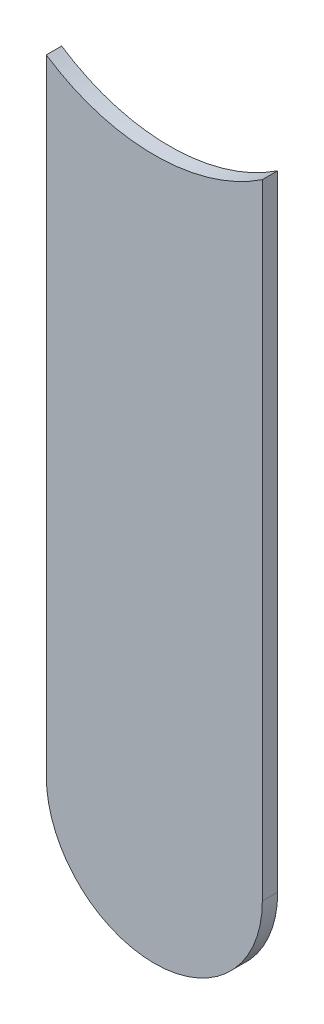
ISO-10303-21;
HEADER;
FILE_DESCRIPTION(('STEP AP214'),'2;1');
FILE_NAME('part.step','',(''),(''),'','','');
FILE_SCHEMA(('AUTOMOTIVE_DESIGN { 1 0 10303 214 1 1 1 1 }'));
ENDSEC;
DATA;
#1=APPLICATION_CONTEXT('core data for automotive mechanical design processes');
#2=APPLICATION_PROTOCOL_DEFINITION('international standard','automotive_design',2000,#1);
#3=PRODUCT_CONTEXT('',#1,'mechanical');
#4=PRODUCT('Part','Part','',(#3));
#5=PRODUCT_RELATED_PRODUCT_CATEGORY('part','',(#4));
#6=PRODUCT_DEFINITION_FORMATION('','',#4);
#7=PRODUCT_DEFINITION_CONTEXT('part definition',#1,'design');
#8=PRODUCT_DEFINITION('design','',#6,#7);
#9=PRODUCT_DEFINITION_SHAPE('','',#8);
#10=(LENGTH_UNIT() NAMED_UNIT(*) SI_UNIT(.MILLI.,.METRE.));
#11=(NAMED_UNIT(*) PLANE_ANGLE_UNIT() SI_UNIT($,.RADIAN.));
#12=(NAMED_UNIT(*) SI_UNIT($,.STERADIAN.) SOLID_ANGLE_UNIT());
#13=UNCERTAINTY_MEASURE_WITH_UNIT(LENGTH_MEASURE(1.E-05),#10,'distance_accuracy_value','');
#14=(GEOMETRIC_REPRESENTATION_CONTEXT(3) GLOBAL_UNCERTAINTY_ASSIGNED_CONTEXT((#13)) GLOBAL_UNIT_ASSIGNED_CONTEXT((#10,
#11,#12)) REPRESENTATION_CONTEXT('',''));
#15=CARTESIAN_POINT('',(0.,0.,0.));
#16=DIRECTION('',(0.,0.,1.));
#17=DIRECTION('',(1.,0.,0.));
#18=AXIS2_PLACEMENT_3D('',#15,#16,#17);
#19=CARTESIAN_POINT('',(112.1100247,114.6800348,0.));
#20=DIRECTION('',(-1.,0.,0.));
#21=DIRECTION('',(0.,1.,0.));
#22=AXIS2_PLACEMENT_3D('',#19,#20,#21);
#23=PLANE('',#22);
#24=DIRECTION('',(0.,1.,0.));
#25=VECTOR('',#24,1.);
#26=CARTESIAN_POINT('',(112.1100247,114.6800348,0.03556));
#27=LINE('',#26,#25);
#28=CARTESIAN_POINT('',(112.1100247,114.6800348,0.03556));
#29=VERTEX_POINT('',#28);
#30=CARTESIAN_POINT('',(112.1100247,116.125830609654,0.03556));
#31=VERTEX_POINT('',#30);
#32=EDGE_CURVE('E11',#29,#31,#27,.T.);
#33=ORIENTED_EDGE('',*,*,#32,.F.);
#34=DIRECTION('',(0.,0.,1.));
#35=VECTOR('',#34,1.);
#36=CARTESIAN_POINT('',(112.1100247,114.6800348,0.));
#37=LINE('',#36,#35);
#38=CARTESIAN_POINT('',(112.1100247,114.6800348,0.));
#39=VERTEX_POINT('',#38);
#40=EDGE_CURVE('E24',#39,#29,#37,.T.);
#41=ORIENTED_EDGE('',*,*,#40,.F.);
#42=DIRECTION('',(0.,1.,0.));
#43=VECTOR('',#42,1.);
#44=CARTESIAN_POINT('',(112.1100247,114.6800348,0.));
#45=LINE('',#44,#43);
#46=CARTESIAN_POINT('',(112.1100247,116.125830609654,0.));
#47=VERTEX_POINT('',#46);
#48=EDGE_CURVE('E75',#39,#47,#45,.T.);
#49=ORIENTED_EDGE('',*,*,#48,.T.);
#50=DIRECTION('',(0.,0.,1.));
#51=VECTOR('',#50,1.);
#52=CARTESIAN_POINT('',(112.1100247,116.125830609654,0.));
#53=LINE('',#52,#51);
#54=EDGE_CURVE('E37',#47,#31,#53,.T.);
#55=ORIENTED_EDGE('',*,*,#54,.T.);
#56=EDGE_LOOP('',(#33,#41,#49,#55));
#57=FACE_BOUND('',#56,.T.);
#58=ADVANCED_FACE('F17',(#57),#23,.F.);
#59=CARTESIAN_POINT('',(111.8600252,116.4999956,0.));
#60=DIRECTION('',(0.,0.,-1.));
#61=DIRECTION('',(1.,0.,0.));
#62=AXIS2_PLACEMENT_3D('',#59,#60,#61);
#63=CYLINDRICAL_SURFACE('',#62,0.4499991);
#64=DIRECTION('',(0.,0.,1.));
#65=VECTOR('',#64,1.);
#66=CARTESIAN_POINT('',(111.6100257,116.125830609654,0.));
#67=LINE('',#66,#65);
#68=CARTESIAN_POINT('',(111.6100257,116.125830609654,0.));
#69=VERTEX_POINT('',#68);
#70=CARTESIAN_POINT('',(111.6100257,116.125830609654,0.03556));
#71=VERTEX_POINT('',#70);
#72=EDGE_CURVE('E67',#69,#71,#67,.T.);
#73=ORIENTED_EDGE('',*,*,#72,.T.);
#74=CARTESIAN_POINT('',(111.8600252,116.4999956,0.03556));
#75=DIRECTION('',(0.,0.,1.));
#76=DIRECTION('',(1.,0.,0.));
#77=AXIS2_PLACEMENT_3D('',#74,#75,#76);
#78=CIRCLE('',#77,0.4499991);
#79=EDGE_CURVE('E82',#71,#31,#78,.T.);
#80=ORIENTED_EDGE('',*,*,#79,.T.);
#81=ORIENTED_EDGE('',*,*,#54,.F.);
#82=CARTESIAN_POINT('',(111.8600252,116.4999956,0.));
#83=DIRECTION('',(0.,0.,1.));
#84=DIRECTION('',(1.,0.,0.));
#85=AXIS2_PLACEMENT_3D('',#82,#83,#84);
#86=CIRCLE('',#85,0.4499991);
#87=EDGE_CURVE('E80',#69,#47,#86,.T.);
#88=ORIENTED_EDGE('',*,*,#87,.F.);
#89=EDGE_LOOP('',(#73,#80,#81,#88));
#90=FACE_BOUND('',#89,.T.);
#91=ADVANCED_FACE('F88',(#90),#63,.F.);
#92=CARTESIAN_POINT('',(111.6100257,116.125830609654,0.));
#93=DIRECTION('',(1.,0.,0.));
#94=DIRECTION('',(0.,-1.,0.));
#95=AXIS2_PLACEMENT_3D('',#92,#93,#94);
#96=PLANE('',#95);
#97=DIRECTION('',(0.,-1.,0.));
#98=VECTOR('',#97,1.);
#99=CARTESIAN_POINT('',(111.6100257,116.4999956,0.03556));
#100=LINE('',#99,#98);
#101=CARTESIAN_POINT('',(111.6100257,114.6800348,0.03556));
#102=VERTEX_POINT('',#101);
#103=EDGE_CURVE('E71',#71,#102,#100,.T.);
#104=ORIENTED_EDGE('',*,*,#103,.F.);
#105=ORIENTED_EDGE('',*,*,#72,.F.);
#106=DIRECTION('',(0.,-1.,0.));
#107=VECTOR('',#106,1.);
#108=CARTESIAN_POINT('',(111.6100257,116.4999956,0.));
#109=LINE('',#108,#107);
#110=CARTESIAN_POINT('',(111.6100257,114.6800348,0.));
#111=VERTEX_POINT('',#110);
#112=EDGE_CURVE('E63',#69,#111,#109,.T.);
#113=ORIENTED_EDGE('',*,*,#112,.T.);
#114=DIRECTION('',(0.,0.,1.));
#115=VECTOR('',#114,1.);
#116=CARTESIAN_POINT('',(111.6100257,114.6800348,0.));
#117=LINE('',#116,#115);
#118=EDGE_CURVE('E53',#111,#102,#117,.T.);
#119=ORIENTED_EDGE('',*,*,#118,.T.);
#120=EDGE_LOOP('',(#104,#105,#113,#119));
#121=FACE_BOUND('',#120,.T.);
#122=ADVANCED_FACE('F66',(#121),#96,.F.);
#123=CARTESIAN_POINT('',(111.8600252,114.6800348,0.));
#124=DIRECTION('',(0.,0.,-1.));
#125=DIRECTION('',(-1.,0.,0.));
#126=AXIS2_PLACEMENT_3D('',#123,#124,#125);
#127=CYLINDRICAL_SURFACE('',#126,0.249999500000001);
#128=CARTESIAN_POINT('',(111.8600252,114.6800348,0.03556));
#129=DIRECTION('',(0.,0.,1.));
#130=DIRECTION('',(-1.,0.,0.));
#131=AXIS2_PLACEMENT_3D('',#128,#129,#130);
#132=CIRCLE('',#131,0.249999500000001);
#133=EDGE_CURVE('E59',#102,#29,#132,.T.);
#134=ORIENTED_EDGE('',*,*,#133,.F.);
#135=ORIENTED_EDGE('',*,*,#118,.F.);
#136=CARTESIAN_POINT('',(111.8600252,114.6800348,0.));
#137=DIRECTION('',(0.,0.,1.));
#138=DIRECTION('',(-1.,0.,0.));
#139=AXIS2_PLACEMENT_3D('',#136,#137,#138);
#140=CIRCLE('',#139,0.249999500000001);
#141=EDGE_CURVE('E57',#111,#39,#140,.T.);
#142=ORIENTED_EDGE('',*,*,#141,.T.);
#143=ORIENTED_EDGE('',*,*,#40,.T.);
#144=EDGE_LOOP('',(#134,#135,#142,#143));
#145=FACE_BOUND('',#144,.T.);
#146=ADVANCED_FACE('F55',(#145),#127,.T.);
#147=CARTESIAN_POINT('',(112.1100247,114.6800348,0.));
#148=DIRECTION('',(0.,0.,-1.));
#149=DIRECTION('',(-1.,0.,0.));
#150=AXIS2_PLACEMENT_3D('',#147,#148,#149);
#151=PLANE('',#150);
#152=ORIENTED_EDGE('',*,*,#48,.F.);
#153=ORIENTED_EDGE('',*,*,#141,.F.);
#154=ORIENTED_EDGE('',*,*,#112,.F.);
#155=ORIENTED_EDGE('',*,*,#87,.T.);
#156=EDGE_LOOP('',(#152,#153,#154,#155));
#157=FACE_BOUND('',#156,.T.);
#158=ADVANCED_FACE('F74',(#157),#151,.T.);
#159=CARTESIAN_POINT('',(112.1100247,114.6800348,0.03556));
#160=DIRECTION('',(0.,0.,-1.));
#161=DIRECTION('',(-1.,0.,0.));
#162=AXIS2_PLACEMENT_3D('',#159,#160,#161);
#163=PLANE('',#162);
#164=ORIENTED_EDGE('',*,*,#133,.T.);
#165=ORIENTED_EDGE('',*,*,#32,.T.);
#166=ORIENTED_EDGE('',*,*,#79,.F.);
#167=ORIENTED_EDGE('',*,*,#103,.T.);
#168=EDGE_LOOP('',(#164,#165,#166,#167));
#169=FACE_BOUND('',#168,.T.);
#170=ADVANCED_FACE('F91',(#169),#163,.F.);
#171=CLOSED_SHELL('',(#58,#91,#122,#146,#158,#170));
#172=MANIFOLD_SOLID_BREP('B1',#171);
#173=ADVANCED_BREP_SHAPE_REPRESENTATION('',(#18,#172),#14);
#174=SHAPE_DEFINITION_REPRESENTATION(#9,#173);
ENDSEC;
END-ISO-10303-21;
